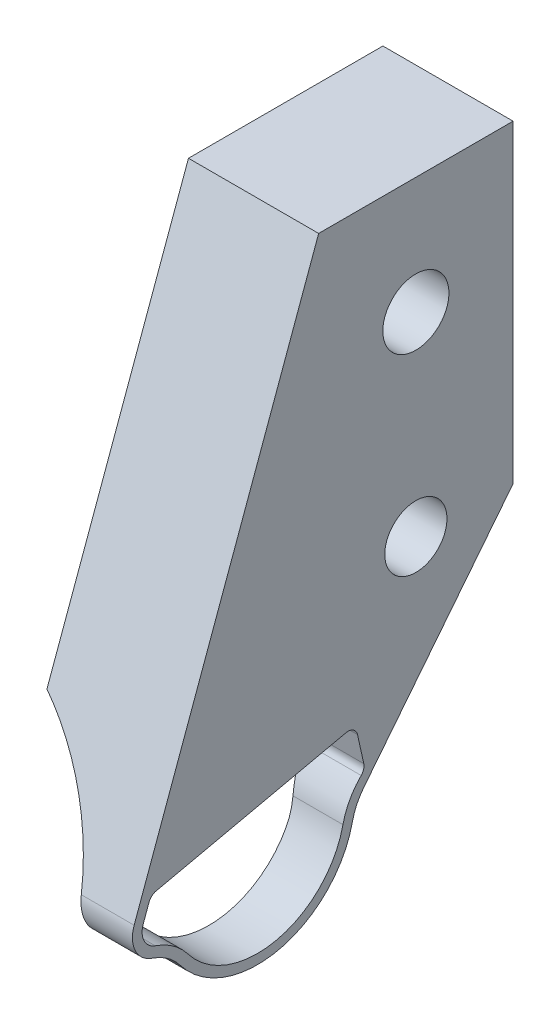
ISO-10303-21;
HEADER;
FILE_DESCRIPTION(('STEP AP214'),'2;1');
FILE_NAME('part.step','',(''),(''),'','','');
FILE_SCHEMA(('AUTOMOTIVE_DESIGN { 1 0 10303 214 1 1 1 1 }'));
ENDSEC;
DATA;
#1=APPLICATION_CONTEXT('core data for automotive mechanical design processes');
#2=APPLICATION_PROTOCOL_DEFINITION('international standard','automotive_design',2000,#1);
#3=PRODUCT_CONTEXT('',#1,'mechanical');
#4=PRODUCT('Part','Part','',(#3));
#5=PRODUCT_RELATED_PRODUCT_CATEGORY('part','',(#4));
#6=PRODUCT_DEFINITION_FORMATION('','',#4);
#7=PRODUCT_DEFINITION_CONTEXT('part definition',#1,'design');
#8=PRODUCT_DEFINITION('design','',#6,#7);
#9=PRODUCT_DEFINITION_SHAPE('','',#8);
#10=(LENGTH_UNIT() NAMED_UNIT(*) SI_UNIT(.MILLI.,.METRE.));
#11=(NAMED_UNIT(*) PLANE_ANGLE_UNIT() SI_UNIT($,.RADIAN.));
#12=(NAMED_UNIT(*) SI_UNIT($,.STERADIAN.) SOLID_ANGLE_UNIT());
#13=UNCERTAINTY_MEASURE_WITH_UNIT(LENGTH_MEASURE(1.E-05),#10,'distance_accuracy_value','');
#14=(GEOMETRIC_REPRESENTATION_CONTEXT(3) GLOBAL_UNCERTAINTY_ASSIGNED_CONTEXT((#13)) GLOBAL_UNIT_ASSIGNED_CONTEXT((#10,
#11,#12)) REPRESENTATION_CONTEXT('',''));
#15=CARTESIAN_POINT('',(0.,0.,0.));
#16=DIRECTION('',(0.,0.,1.));
#17=DIRECTION('',(1.,0.,0.));
#18=AXIS2_PLACEMENT_3D('',#15,#16,#17);
#19=CARTESIAN_POINT('',(10.4806228885964,56.7479660865774,0.));
#20=DIRECTION('',(-1.,0.,0.));
#21=DIRECTION('',(0.,0.,-1.));
#22=AXIS2_PLACEMENT_3D('',#19,#20,#21);
#23=CYLINDRICAL_SURFACE('',#22,1.7);
#24=CARTESIAN_POINT('',(-20.145,56.7479660865774,0.));
#25=DIRECTION('',(-1.,0.,0.));
#26=DIRECTION('',(0.,0.,1.));
#27=AXIS2_PLACEMENT_3D('',#24,#25,#26);
#28=CIRCLE('',#27,1.7);
#29=CARTESIAN_POINT('',(-20.145,56.7479660865774,1.7));
#30=VERTEX_POINT('',#29);
#31=EDGE_CURVE('E249',#30,#30,#28,.F.);
#32=ORIENTED_EDGE('',*,*,#31,.F.);
#33=EDGE_LOOP('',(#32));
#34=FACE_BOUND('',#33,.T.);
#35=CARTESIAN_POINT('',(-13.45,56.7479660865774,0.));
#36=DIRECTION('',(-1.,0.,0.));
#37=DIRECTION('',(0.,0.,1.));
#38=AXIS2_PLACEMENT_3D('',#35,#36,#37);
#39=CIRCLE('',#38,1.7);
#40=CARTESIAN_POINT('',(-13.45,56.7479660865774,1.7));
#41=VERTEX_POINT('',#40);
#42=EDGE_CURVE('E472',#41,#41,#39,.T.);
#43=ORIENTED_EDGE('',*,*,#42,.F.);
#44=EDGE_LOOP('',(#43));
#45=FACE_BOUND('',#44,.T.);
#46=ADVANCED_FACE('F41',(#34,#45),#23,.F.);
#47=CARTESIAN_POINT('',(10.4806228885964,15.5435493709328,19.6130723748181));
#48=DIRECTION('',(0.,-0.621108997236021,-0.78372419482396));
#49=DIRECTION('',(0.,-0.78372419482396,0.621108997236021));
#50=AXIS2_PLACEMENT_3D('',#47,#48,#49);
#51=PLANE('',#50);
#52=DIRECTION('',(0.,0.78372419482396,-0.621108997236021));
#53=VECTOR('',#52,1.);
#54=CARTESIAN_POINT('',(-20.145,15.5435493709328,19.6130723748181));
#55=LINE('',#54,#53);
#56=CARTESIAN_POINT('',(-20.145,42.7479660865774,-1.94669073858206));
#57=VERTEX_POINT('',#56);
#58=CARTESIAN_POINT('',(-20.145,46.6006752778822,-4.99999999999999));
#59=VERTEX_POINT('',#58);
#60=EDGE_CURVE('E246',#57,#59,#55,.T.);
#61=ORIENTED_EDGE('',*,*,#60,.T.);
#62=DIRECTION('',(-1.,0.,0.));
#63=VECTOR('',#62,1.);
#64=CARTESIAN_POINT('',(10.4806228885964,46.6006752778822,-5.));
#65=LINE('',#64,#63);
#66=CARTESIAN_POINT('',(-13.45,46.6006752778822,-4.99999999999999));
#67=VERTEX_POINT('',#66);
#68=EDGE_CURVE('E255',#67,#59,#65,.T.);
#69=ORIENTED_EDGE('',*,*,#68,.F.);
#70=DIRECTION('',(0.,-0.78372419482396,0.621108997236021));
#71=VECTOR('',#70,1.);
#72=CARTESIAN_POINT('',(-13.45,15.5435493709328,19.6130723748181));
#73=LINE('',#72,#71);
#74=CARTESIAN_POINT('',(-13.45,36.9081913573618,2.6813871619121));
#75=VERTEX_POINT('',#74);
#76=EDGE_CURVE('E467',#67,#75,#73,.T.);
#77=ORIENTED_EDGE('',*,*,#76,.T.);
#78=DIRECTION('',(-1.,0.,0.));
#79=VECTOR('',#78,1.);
#80=CARTESIAN_POINT('',(23.2149341165803,36.9081913573618,2.68138716191209));
#81=LINE('',#80,#79);
#82=CARTESIAN_POINT('',(-16.218762442943,36.9081913573618,2.6813871619121));
#83=VERTEX_POINT('',#82);
#84=EDGE_CURVE('E226',#75,#83,#81,.T.);
#85=ORIENTED_EDGE('',*,*,#84,.T.);
#86=CARTESIAN_POINT('',(-25.95,34.6053636156226,4.50640039861617));
#87=DIRECTION('',(0.,0.621108997236021,0.78372419482396));
#88=DIRECTION('',(0.,0.78372419482396,-0.621108997236021));
#89=AXIS2_PLACEMENT_3D('',#86,#87,#88);
#90=ELLIPSE('',#89,12.7595907668082,10.);
#91=EDGE_CURVE('E268',#57,#83,#90,.F.);
#92=ORIENTED_EDGE('',*,*,#91,.F.);
#93=EDGE_LOOP('',(#61,#69,#77,#85,#92));
#94=FACE_BOUND('',#93,.T.);
#95=ADVANCED_FACE('F495',(#94),#51,.T.);
#96=CARTESIAN_POINT('',(10.4806228885964,0.,-4.99999999999999));
#97=DIRECTION('',(0.,0.,1.));
#98=DIRECTION('',(-1.,0.,0.));
#99=AXIS2_PLACEMENT_3D('',#96,#97,#98);
#100=PLANE('',#99);
#101=ORIENTED_EDGE('',*,*,#68,.T.);
#102=DIRECTION('',(0.,-1.,0.));
#103=VECTOR('',#102,1.);
#104=CARTESIAN_POINT('',(-20.145,0.,-4.99999999999999));
#105=LINE('',#104,#103);
#106=CARTESIAN_POINT('',(-20.145,62.7479660865774,-4.99999999999999));
#107=VERTEX_POINT('',#106);
#108=EDGE_CURVE('E244',#107,#59,#105,.T.);
#109=ORIENTED_EDGE('',*,*,#108,.F.);
#110=DIRECTION('',(-1.,0.,0.));
#111=VECTOR('',#110,1.);
#112=CARTESIAN_POINT('',(10.4806228885964,62.7479660865774,-5.));
#113=LINE('',#112,#111);
#114=CARTESIAN_POINT('',(-13.45,62.7479660865774,-4.99999999999999));
#115=VERTEX_POINT('',#114);
#116=EDGE_CURVE('E258',#115,#107,#113,.T.);
#117=ORIENTED_EDGE('',*,*,#116,.F.);
#118=DIRECTION('',(0.,1.,0.));
#119=VECTOR('',#118,1.);
#120=CARTESIAN_POINT('',(-13.45,0.,-4.99999999999999));
#121=LINE('',#120,#119);
#122=EDGE_CURVE('E464',#67,#115,#121,.T.);
#123=ORIENTED_EDGE('',*,*,#122,.F.);
#124=EDGE_LOOP('',(#101,#109,#117,#123));
#125=FACE_BOUND('',#124,.T.);
#126=ADVANCED_FACE('F501',(#125),#100,.F.);
#127=CARTESIAN_POINT('',(10.4806228885964,62.7479660865774,0.));
#128=DIRECTION('',(0.,-1.,0.));
#129=DIRECTION('',(1.,0.,0.));
#130=AXIS2_PLACEMENT_3D('',#127,#128,#129);
#131=PLANE('',#130);
#132=ORIENTED_EDGE('',*,*,#116,.T.);
#133=DIRECTION('',(0.,0.,-1.));
#134=VECTOR('',#133,1.);
#135=CARTESIAN_POINT('',(-20.145,62.7479660865774,0.));
#136=LINE('',#135,#134);
#137=CARTESIAN_POINT('',(-20.145,62.7479660865774,5.));
#138=VERTEX_POINT('',#137);
#139=EDGE_CURVE('E242',#138,#107,#136,.T.);
#140=ORIENTED_EDGE('',*,*,#139,.F.);
#141=DIRECTION('',(-1.,0.,0.));
#142=VECTOR('',#141,1.);
#143=CARTESIAN_POINT('',(10.4806228885964,62.7479660865774,5.));
#144=LINE('',#143,#142);
#145=CARTESIAN_POINT('',(-13.45,62.7479660865774,5.));
#146=VERTEX_POINT('',#145);
#147=EDGE_CURVE('E261',#146,#138,#144,.T.);
#148=ORIENTED_EDGE('',*,*,#147,.F.);
#149=DIRECTION('',(0.,0.,1.));
#150=VECTOR('',#149,1.);
#151=CARTESIAN_POINT('',(-13.45,62.7479660865774,0.));
#152=LINE('',#151,#150);
#153=EDGE_CURVE('E461',#115,#146,#152,.T.);
#154=ORIENTED_EDGE('',*,*,#153,.F.);
#155=EDGE_LOOP('',(#132,#140,#148,#154));
#156=FACE_BOUND('',#155,.T.);
#157=ADVANCED_FACE('F511',(#156),#131,.F.);
#158=CARTESIAN_POINT('',(10.4806228885964,8.94708669868443,24.5819186745387));
#159=DIRECTION('',(0.,-0.342020143325663,-0.939692620785911));
#160=DIRECTION('',(0.,-0.939692620785911,0.342020143325663));
#161=AXIS2_PLACEMENT_3D('',#158,#159,#160);
#162=PLANE('',#161);
#163=ORIENTED_EDGE('',*,*,#147,.T.);
#164=DIRECTION('',(0.,0.93969262078591,-0.342020143325663));
#165=VECTOR('',#164,1.);
#166=CARTESIAN_POINT('',(-20.145,8.94708669868443,24.5819186745387));
#167=LINE('',#166,#165);
#168=CARTESIAN_POINT('',(-20.145,42.7479660865774,12.2794046853239));
#169=VERTEX_POINT('',#168);
#170=EDGE_CURVE('E240',#169,#138,#167,.T.);
#171=ORIENTED_EDGE('',*,*,#170,.F.);
#172=CARTESIAN_POINT('',(-25.95,34.6053636156226,15.2430696142139));
#173=DIRECTION('',(0.,0.342020143325663,0.939692620785911));
#174=DIRECTION('',(0.,0.93969262078591,-0.342020143325663));
#175=AXIS2_PLACEMENT_3D('',#172,#173,#174);
#176=ELLIPSE('',#175,10.6417777247591,10.);
#177=CARTESIAN_POINT('',(-16.1675328753228,36.6798122061183,14.4880320747579));
#178=VERTEX_POINT('',#177);
#179=EDGE_CURVE('E11',#178,#169,#176,.T.);
#180=ORIENTED_EDGE('',*,*,#179,.F.);
#181=DIRECTION('',(-1.,0.,0.));
#182=VECTOR('',#181,1.);
#183=CARTESIAN_POINT('',(23.2149341165803,36.6798122061183,14.4880320747579));
#184=LINE('',#183,#182);
#185=CARTESIAN_POINT('',(-13.45,36.6798122061183,14.4880320747579));
#186=VERTEX_POINT('',#185);
#187=EDGE_CURVE('E229',#186,#178,#184,.T.);
#188=ORIENTED_EDGE('',*,*,#187,.F.);
#189=DIRECTION('',(0.,-0.939692620785911,0.342020143325663));
#190=VECTOR('',#189,1.);
#191=CARTESIAN_POINT('',(-13.45,8.94708669868443,24.5819186745387));
#192=LINE('',#191,#190);
#193=EDGE_CURVE('E458',#146,#186,#192,.T.);
#194=ORIENTED_EDGE('',*,*,#193,.F.);
#195=EDGE_LOOP('',(#163,#171,#180,#188,#194));
#196=FACE_BOUND('',#195,.T.);
#197=ADVANCED_FACE('F514',(#196),#162,.F.);
#198=CARTESIAN_POINT('',(-20.145,0.,0.));
#199=DIRECTION('',(1.,0.,0.));
#200=DIRECTION('',(0.,0.,1.));
#201=AXIS2_PLACEMENT_3D('',#198,#199,#200);
#202=PLANE('',#201);
#203=DIRECTION('',(0.,0.,-1.));
#204=VECTOR('',#203,1.);
#205=CARTESIAN_POINT('',(-20.145,42.7479660865774,0.));
#206=LINE('',#205,#204);
#207=EDGE_CURVE('E236',#169,#57,#206,.T.);
#208=ORIENTED_EDGE('',*,*,#207,.F.);
#209=ORIENTED_EDGE('',*,*,#170,.T.);
#210=ORIENTED_EDGE('',*,*,#139,.T.);
#211=ORIENTED_EDGE('',*,*,#108,.T.);
#212=ORIENTED_EDGE('',*,*,#60,.F.);
#213=EDGE_LOOP('',(#208,#209,#210,#211,#212));
#214=FACE_BOUND('',#213,.T.);
#215=ORIENTED_EDGE('',*,*,#31,.T.);
#216=EDGE_LOOP('',(#215));
#217=FACE_BOUND('',#216,.T.);
#218=CARTESIAN_POINT('',(-20.145,46.7479660865774,0.));
#219=DIRECTION('',(-1.,0.,0.));
#220=DIRECTION('',(0.,0.,1.));
#221=AXIS2_PLACEMENT_3D('',#218,#219,#220);
#222=CIRCLE('',#221,1.59999999999999);
#223=CARTESIAN_POINT('',(-20.145,46.7479660865774,1.6));
#224=VERTEX_POINT('',#223);
#225=EDGE_CURVE('E252',#224,#224,#222,.T.);
#226=ORIENTED_EDGE('',*,*,#225,.F.);
#227=EDGE_LOOP('',(#226));
#228=FACE_BOUND('',#227,.T.);
#229=ADVANCED_FACE('F517',(#214,#217,#228),#202,.F.);
#230=CARTESIAN_POINT('',(10.4806228885964,46.7479660865774,0.));
#231=DIRECTION('',(-1.,0.,0.));
#232=DIRECTION('',(0.,0.,-1.));
#233=AXIS2_PLACEMENT_3D('',#230,#231,#232);
#234=CYLINDRICAL_SURFACE('',#233,1.59999999999999);
#235=ORIENTED_EDGE('',*,*,#225,.T.);
#236=EDGE_LOOP('',(#235));
#237=FACE_BOUND('',#236,.T.);
#238=CARTESIAN_POINT('',(-13.45,46.7479660865774,0.));
#239=DIRECTION('',(-1.,0.,0.));
#240=DIRECTION('',(0.,0.,1.));
#241=AXIS2_PLACEMENT_3D('',#238,#239,#240);
#242=CIRCLE('',#241,1.59999999999999);
#243=CARTESIAN_POINT('',(-13.45,46.7479660865774,1.6));
#244=VERTEX_POINT('',#243);
#245=EDGE_CURVE('E203',#244,#244,#242,.T.);
#246=ORIENTED_EDGE('',*,*,#245,.F.);
#247=EDGE_LOOP('',(#246));
#248=FACE_BOUND('',#247,.T.);
#249=ADVANCED_FACE('F292',(#237,#248),#234,.F.);
#250=CARTESIAN_POINT('',(23.2149341165803,35.0448643656538,0.330214577440214));
#251=DIRECTION('',(-1.,0.,0.));
#252=DIRECTION('',(0.,0.,-1.));
#253=AXIS2_PLACEMENT_3D('',#250,#251,#252);
#254=CYLINDRICAL_SURFACE('',#253,3.);
#255=DIRECTION('',(-1.,0.,0.));
#256=VECTOR('',#255,1.);
#257=CARTESIAN_POINT('',(23.2149341165803,35.6835275110001,3.26144459004179));
#258=LINE('',#257,#256);
#259=CARTESIAN_POINT('',(-13.45,35.6835275110001,3.2614445900418));
#260=VERTEX_POINT('',#259);
#261=CARTESIAN_POINT('',(-16.0082917657626,35.6835275110001,3.2614445900418));
#262=VERTEX_POINT('',#261);
#263=EDGE_CURVE('E223',#260,#262,#258,.T.);
#264=ORIENTED_EDGE('',*,*,#263,.T.);
#265=CARTESIAN_POINT('',(-16.218762442943,36.9081913573618,2.68138716191209));
#266=CARTESIAN_POINT('',(-16.2031119911732,36.8420785486139,2.73379025762021));
#267=CARTESIAN_POINT('',(-16.1876509206205,36.7737158458215,2.78342011184647));
#268=CARTESIAN_POINT('',(-16.1574372357355,36.6328930276627,2.87683965137037));
#269=CARTESIAN_POINT('',(-16.1426851155635,36.5604301287947,2.92062529980248));
#270=CARTESIAN_POINT('',(-16.1145125601555,36.4133169873703,3.00121435499207));
#271=CARTESIAN_POINT('',(-16.1010721010692,36.3387347674945,3.03813494453304));
#272=CARTESIAN_POINT('',(-16.0755080420653,36.186612978632,3.10570191181529));
#273=CARTESIAN_POINT('',(-16.0633835951442,36.1090753557327,3.13635233649673));
#274=CARTESIAN_POINT('',(-16.0439162058909,35.9738508455854,3.18338079291822));
#275=CARTESIAN_POINT('',(-16.0361918214002,35.9167640600316,3.20134213050387));
#276=CARTESIAN_POINT('',(-16.0215756819415,35.8011149118365,3.23395732595414));
#277=CARTESIAN_POINT('',(-16.0146900732958,35.742545061221,3.24858738057316));
#278=CARTESIAN_POINT('',(-16.0082917657626,35.6835275110001,3.26144459004185));
#279=B_SPLINE_CURVE_WITH_KNOTS('',3,(#265,#266,#267,#268,#269,#270,#271,#272,#273,#274,#275,
#276,#277,#278),.UNSPECIFIED.,.F.,.F.,(4,2,2,2,2,2,4),(0.,0.257340284217624,0.514857415468429,
0.76746588898362,1.01991080389975,1.2008304064854,1.38300479014081),.UNSPECIFIED.);
#280=EDGE_CURVE('E271',#83,#262,#279,.T.);
#281=ORIENTED_EDGE('',*,*,#280,.F.);
#282=ORIENTED_EDGE('',*,*,#84,.F.);
#283=CARTESIAN_POINT('',(-13.45,35.0448643656538,0.330214577440219));
#284=DIRECTION('',(-1.,0.,0.));
#285=DIRECTION('',(0.,0.,1.));
#286=AXIS2_PLACEMENT_3D('',#283,#284,#285);
#287=CIRCLE('',#286,3.);
#288=EDGE_CURVE('E470',#260,#75,#287,.T.);
#289=ORIENTED_EDGE('',*,*,#288,.F.);
#290=EDGE_LOOP('',(#264,#281,#282,#289));
#291=FACE_BOUND('',#290,.T.);
#292=ADVANCED_FACE('F286',(#291),#254,.F.);
#293=CARTESIAN_POINT('',(23.2149341165803,36.1667819911298,13.0784931435791));
#294=DIRECTION('',(-1.,0.,0.));
#295=DIRECTION('',(0.,0.,-1.));
#296=AXIS2_PLACEMENT_3D('',#293,#294,#295);
#297=CYLINDRICAL_SURFACE('',#296,1.5);
#298=CARTESIAN_POINT('',(-13.45,36.1667819911298,13.0784931435791));
#299=DIRECTION('',(-1.,0.,0.));
#300=DIRECTION('',(0.,0.,1.));
#301=AXIS2_PLACEMENT_3D('',#298,#299,#300);
#302=CIRCLE('',#301,1.5);
#303=CARTESIAN_POINT('',(-13.45,34.7448507210714,13.556103301794));
#304=VERTEX_POINT('',#303);
#305=EDGE_CURVE('E456',#304,#186,#302,.T.);
#306=ORIENTED_EDGE('',*,*,#305,.T.);
#307=ORIENTED_EDGE('',*,*,#187,.T.);
#308=CARTESIAN_POINT('',(-15.9509728799541,34.7448507210714,13.556103301794));
#309=CARTESIAN_POINT('',(-15.9511611201098,34.7582575404278,13.5960169486821));
#310=CARTESIAN_POINT('',(-15.951397209145,34.7733390237569,13.6353467117156));
#311=CARTESIAN_POINT('',(-15.9520138071208,34.8067511977555,13.7125981174369));
#312=CARTESIAN_POINT('',(-15.9523943111477,34.8250817778653,13.7505198079852));
#313=CARTESIAN_POINT('',(-15.9538240979371,34.8847381359718,13.8617037209504));
#314=CARTESIAN_POINT('',(-15.9551619317631,34.9307698306167,13.9325073363417));
#315=CARTESIAN_POINT('',(-15.9590587021174,35.0340284310216,14.0653887732117));
#316=CARTESIAN_POINT('',(-15.9616183417922,35.0912617720998,14.1274615434436));
#317=CARTESIAN_POINT('',(-15.9684230385377,35.215254094426,14.2411024473258));
#318=CARTESIAN_POINT('',(-15.9726676969909,35.2820108203781,14.2926730610624));
#319=CARTESIAN_POINT('',(-15.9832240931038,35.4228876849543,14.383727605055));
#320=CARTESIAN_POINT('',(-15.989529833075,35.4969860288151,14.4232459695963));
#321=CARTESIAN_POINT('',(-16.0044703700032,35.6505354826737,14.4893352183812));
#322=CARTESIAN_POINT('',(-16.0131053396198,35.7299869891596,14.5159051423812));
#323=CARTESIAN_POINT('',(-16.0327668085834,35.8918825536113,14.5554405982331));
#324=CARTESIAN_POINT('',(-16.0437925288181,35.9743256293955,14.5684105541077));
#325=CARTESIAN_POINT('',(-16.0680871574535,36.1398985366373,14.5805466630833));
#326=CARTESIAN_POINT('',(-16.0813559134736,36.2230283210786,14.5797137535083));
#327=CARTESIAN_POINT('',(-16.1066107582631,36.3694267785127,14.5661364499318));
#328=CARTESIAN_POINT('',(-16.1182316048985,36.4330222113839,14.5560669214766));
#329=CARTESIAN_POINT('',(-16.1423150831483,36.5581644441492,14.5279541111028));
#330=CARTESIAN_POINT('',(-16.1547765006713,36.6197140148813,14.5099221294437));
#331=CARTESIAN_POINT('',(-16.1675328753228,36.6798122061183,14.4880320747579));
#332=B_SPLINE_CURVE_WITH_KNOTS('',3,(#308,#309,#310,#311,#312,#313,#314,#315,#316,#317,#318,
#319,#320,#321,#322,#323,#324,#325,#326,#327,#328,#329,#330,#331),.UNSPECIFIED.,.F.,.F.,(4,2,2,
2,2,2,2,2,2,2,2,4),(0.,0.126239367634021,0.252474440439615,0.504561541556302,0.756793893459327,
1.00896661139762,1.26041195142526,1.51187593555478,1.76325809391521,2.01462318150252,
2.21040081664307,2.40590149403265),.UNSPECIFIED.);
#333=CARTESIAN_POINT('',(-15.9509728799541,34.7448507210714,13.556103301794));
#334=VERTEX_POINT('',#333);
#335=EDGE_CURVE('E50',#334,#178,#332,.T.);
#336=ORIENTED_EDGE('',*,*,#335,.F.);
#337=DIRECTION('',(-1.,0.,0.));
#338=VECTOR('',#337,1.);
#339=CARTESIAN_POINT('',(23.2149341165803,34.7448507210714,13.556103301794));
#340=LINE('',#339,#338);
#341=EDGE_CURVE('E231',#304,#334,#340,.T.);
#342=ORIENTED_EDGE('',*,*,#341,.F.);
#343=EDGE_LOOP('',(#306,#307,#336,#342));
#344=FACE_BOUND('',#343,.T.);
#345=ADVANCED_FACE('F291',(#344),#297,.T.);
#346=CARTESIAN_POINT('',(23.2149341165803,31.9009881809546,14.5113236182238));
#347=DIRECTION('',(-1.,0.,0.));
#348=DIRECTION('',(0.,0.,-1.));
#349=AXIS2_PLACEMENT_3D('',#346,#347,#348);
#350=CYLINDRICAL_SURFACE('',#349,3.);
#351=ORIENTED_EDGE('',*,*,#341,.T.);
#352=CARTESIAN_POINT('',(-15.95,34.6053636156226,13.2127268723614));
#353=CARTESIAN_POINT('',(-15.9500256136083,34.6321501026627,13.2685191916852));
#354=CARTESIAN_POINT('',(-15.9501194937417,34.6571672716219,13.3250300537554));
#355=CARTESIAN_POINT('',(-15.9504437870593,34.7036629734489,13.4394888635619));
#356=CARTESIAN_POINT('',(-15.9506742002439,34.725141506306,13.4974368113026));
#357=CARTESIAN_POINT('',(-15.9509728799541,34.7448507210714,13.556103301794));
#358=B_SPLINE_CURVE_WITH_KNOTS('',3,(#352,#353,#354,#355,#356,#357),.UNSPECIFIED.,.F.,.F.,(4,2,
4),(0.,0.185402550665165,0.370805101892429),.UNSPECIFIED.);
#359=CARTESIAN_POINT('',(-15.95,34.6053636156226,13.2127268723614));
#360=VERTEX_POINT('',#359);
#361=EDGE_CURVE('E60',#360,#334,#358,.T.);
#362=ORIENTED_EDGE('',*,*,#361,.F.);
#363=CARTESIAN_POINT('',(-15.95,31.9009881809546,14.5113236182238));
#364=DIRECTION('',(-1.,0.,0.));
#365=DIRECTION('',(0.,0.,1.));
#366=AXIS2_PLACEMENT_3D('',#363,#364,#365);
#367=CIRCLE('',#366,3.);
#368=CARTESIAN_POINT('',(-15.95,33.7186048955631,12.1246377405315));
#369=VERTEX_POINT('',#368);
#370=EDGE_CURVE('E219',#360,#369,#367,.T.);
#371=ORIENTED_EDGE('',*,*,#370,.T.);
#372=DIRECTION('',(-1.,0.,0.));
#373=VECTOR('',#372,1.);
#374=CARTESIAN_POINT('',(23.2149341165803,33.7186048955631,12.1246377405315));
#375=LINE('',#374,#373);
#376=CARTESIAN_POINT('',(-13.45,33.7186048955631,12.1246377405315));
#377=VERTEX_POINT('',#376);
#378=EDGE_CURVE('E233',#377,#369,#375,.T.);
#379=ORIENTED_EDGE('',*,*,#378,.F.);
#380=CARTESIAN_POINT('',(-13.45,31.9009881809546,14.5113236182238));
#381=DIRECTION('',(-1.,0.,0.));
#382=DIRECTION('',(0.,0.,1.));
#383=AXIS2_PLACEMENT_3D('',#380,#381,#382);
#384=CIRCLE('',#383,3.);
#385=EDGE_CURVE('E453',#304,#377,#384,.T.);
#386=ORIENTED_EDGE('',*,*,#385,.F.);
#387=EDGE_LOOP('',(#351,#362,#371,#379,#386));
#388=FACE_BOUND('',#387,.T.);
#389=ADVANCED_FACE('F299',(#388),#350,.F.);
#390=CARTESIAN_POINT('',(23.2149341165803,36.7479660865774,8.14682794437777));
#391=DIRECTION('',(-1.,0.,0.));
#392=DIRECTION('',(0.,0.,-1.));
#393=AXIS2_PLACEMENT_3D('',#390,#391,#392);
#394=CYLINDRICAL_SURFACE('',#393,5.);
#395=CARTESIAN_POINT('',(-13.45,36.7479660865774,8.14682794437778));
#396=DIRECTION('',(-1.,0.,0.));
#397=DIRECTION('',(0.,0.,1.));
#398=AXIS2_PLACEMENT_3D('',#395,#396,#397);
#399=CIRCLE('',#398,5.);
#400=EDGE_CURVE('E451',#260,#377,#399,.T.);
#401=ORIENTED_EDGE('',*,*,#400,.T.);
#402=ORIENTED_EDGE('',*,*,#378,.T.);
#403=CARTESIAN_POINT('',(-15.95,36.7479660865774,8.14682794437778));
#404=DIRECTION('',(-1.,0.,0.));
#405=DIRECTION('',(0.,0.,1.));
#406=AXIS2_PLACEMENT_3D('',#403,#404,#405);
#407=CIRCLE('',#406,5.);
#408=CARTESIAN_POINT('',(-15.95,34.6053636156226,3.62916763715478));
#409=VERTEX_POINT('',#408);
#410=EDGE_CURVE('E217',#409,#369,#407,.T.);
#411=ORIENTED_EDGE('',*,*,#410,.F.);
#412=CARTESIAN_POINT('',(-16.0082917657626,35.6835275110001,3.2614445900418));
#413=CARTESIAN_POINT('',(-15.9982235133905,35.5907413538277,3.28165484114388));
#414=CARTESIAN_POINT('',(-15.9895284768808,35.4983934612272,3.30455079365494));
#415=CARTESIAN_POINT('',(-15.9748140726766,35.3153192273774,3.35553364426875));
#416=CARTESIAN_POINT('',(-15.9687843100843,35.2245879349925,3.3835997598736));
#417=CARTESIAN_POINT('',(-15.9592521174647,35.0447568195509,3.44490247825155));
#418=CARTESIAN_POINT('',(-15.9557496540813,34.9556569749768,3.47813901277653));
#419=CARTESIAN_POINT('',(-15.9511165422667,34.7790941225902,3.54979957166166));
#420=CARTESIAN_POINT('',(-15.9499953194228,34.6916389726786,3.58824357269477));
#421=CARTESIAN_POINT('',(-15.95,34.6053636156226,3.62916763715478));
#422=B_SPLINE_CURVE_WITH_KNOTS('',3,(#412,#413,#414,#415,#416,#417,#418,#419,#420,#421),
.UNSPECIFIED.,.F.,.F.,(4,2,2,2,4),(0.,0.286430441654338,0.571733694147017,0.857033181033154,
1.14345987091277),.UNSPECIFIED.);
#423=EDGE_CURVE('E279',#262,#409,#422,.T.);
#424=ORIENTED_EDGE('',*,*,#423,.F.);
#425=ORIENTED_EDGE('',*,*,#263,.F.);
#426=EDGE_LOOP('',(#401,#402,#411,#424,#425));
#427=FACE_BOUND('',#426,.T.);
#428=ADVANCED_FACE('F412',(#427),#394,.T.);
#429=CARTESIAN_POINT('',(23.2149341165803,37.8650202363476,3.16688883878769));
#430=DIRECTION('',(-1.,0.,0.));
#431=DIRECTION('',(0.,0.,-1.));
#432=AXIS2_PLACEMENT_3D('',#429,#430,#431);
#433=CYLINDRICAL_SURFACE('',#432,0.499999999999999);
#434=DIRECTION('',(-1.,0.,0.));
#435=VECTOR('',#434,1.);
#436=CARTESIAN_POINT('',(23.2149341165803,37.9732400433166,2.67874083522772));
#437=LINE('',#436,#435);
#438=CARTESIAN_POINT('',(-13.45,37.9732400433166,2.67874083522772));
#439=VERTEX_POINT('',#438);
#440=CARTESIAN_POINT('',(-16.5341936952918,37.9732400433166,2.67874083522772));
#441=VERTEX_POINT('',#440);
#442=EDGE_CURVE('E200',#439,#441,#437,.T.);
#443=ORIENTED_EDGE('',*,*,#442,.T.);
#444=CARTESIAN_POINT('',(-16.3818991608927,37.5125007525109,2.81230455611926));
#445=CARTESIAN_POINT('',(-16.3881447743461,37.5330664879469,2.7918262014019));
#446=CARTESIAN_POINT('',(-16.3949847514548,37.5553313472582,2.77328301581002));
#447=CARTESIAN_POINT('',(-16.4096479321952,37.6024075035502,2.74045142767633));
#448=CARTESIAN_POINT('',(-16.4174678989011,37.6272103701067,2.72614951692839));
#449=CARTESIAN_POINT('',(-16.4339240964108,37.6786405744617,2.70205472776288));
#450=CARTESIAN_POINT('',(-16.4425599255748,37.7052670127792,2.6922596444841));
#451=CARTESIAN_POINT('',(-16.4604524629809,37.7596157725324,2.67731297123646));
#452=CARTESIAN_POINT('',(-16.4697096824333,37.7873389883809,2.67216525617399));
#453=CARTESIAN_POINT('',(-16.4881253527691,37.8416737808754,2.66672774018356));
#454=CARTESIAN_POINT('',(-16.4972641848201,37.8682687656963,2.66620063692089));
#455=CARTESIAN_POINT('',(-16.5156772999521,37.9211377106675,2.66934075881368));
#456=CARTESIAN_POINT('',(-16.5249514632567,37.9474119208864,2.67300447364565));
#457=CARTESIAN_POINT('',(-16.5341936952918,37.9732400433166,2.67874083522772));
#458=B_SPLINE_CURVE_WITH_KNOTS('',3,(#444,#445,#446,#447,#448,#449,#450,#451,#452,#453,#454,
#455,#456,#457),.UNSPECIFIED.,.F.,.F.,(4,2,2,2,2,2,4),(0.,0.0889011732931152,0.17751608334903,
0.266087594390686,0.354732887017099,0.438797114590686,0.522790979606495),.UNSPECIFIED.);
#459=CARTESIAN_POINT('',(-16.3818991608927,37.5125007525109,2.81230455611926));
#460=VERTEX_POINT('',#459);
#461=EDGE_CURVE('E398',#460,#441,#458,.T.);
#462=ORIENTED_EDGE('',*,*,#461,.F.);
#463=DIRECTION('',(-1.,0.,0.));
#464=VECTOR('',#463,1.);
#465=CARTESIAN_POINT('',(23.2149341165803,37.5125007525109,2.81230455611925));
#466=LINE('',#465,#464);
#467=CARTESIAN_POINT('',(-13.45,37.5125007525109,2.81230455611926));
#468=VERTEX_POINT('',#467);
#469=EDGE_CURVE('E202',#468,#460,#466,.T.);
#470=ORIENTED_EDGE('',*,*,#469,.F.);
#471=CARTESIAN_POINT('',(-13.45,37.8650202363476,3.16688883878769));
#472=DIRECTION('',(-1.,0.,0.));
#473=DIRECTION('',(0.,0.,1.));
#474=AXIS2_PLACEMENT_3D('',#471,#472,#473);
#475=CIRCLE('',#474,0.499999999999999);
#476=EDGE_CURVE('E187',#439,#468,#475,.T.);
#477=ORIENTED_EDGE('',*,*,#476,.F.);
#478=EDGE_LOOP('',(#443,#462,#470,#477));
#479=FACE_BOUND('',#478,.T.);
#480=ADVANCED_FACE('F198',(#479),#433,.F.);
#481=CARTESIAN_POINT('',(23.2149341165803,1.21285604880447,-5.4708400930604));
#482=DIRECTION('',(0.,-0.216439613938098,0.976296007119934));
#483=DIRECTION('',(0.,0.976296007119934,0.216439613938098));
#484=AXIS2_PLACEMENT_3D('',#481,#482,#483);
#485=PLANE('',#484);
#486=DIRECTION('',(-1.,0.,0.));
#487=VECTOR('',#486,1.);
#488=CARTESIAN_POINT('',(23.2149341165803,39.4252661460618,3.00064727222454));
#489=LINE('',#488,#487);
#490=CARTESIAN_POINT('',(-13.45,39.4252661460618,3.00064727222455));
#491=VERTEX_POINT('',#490);
#492=CARTESIAN_POINT('',(-17.1882342192304,39.4252661460618,3.00064727222455));
#493=VERTEX_POINT('',#492);
#494=EDGE_CURVE('E209',#491,#493,#489,.T.);
#495=ORIENTED_EDGE('',*,*,#494,.T.);
#496=CARTESIAN_POINT('',(-25.95,34.6053636156226,1.932100606767));
#497=DIRECTION('',(0.,0.216439613938098,-0.976296007119934));
#498=DIRECTION('',(0.,-0.976296007119934,-0.216439613938098));
#499=AXIS2_PLACEMENT_3D('',#496,#497,#498);
#500=ELLIPSE('',#499,10.2427951431451,10.);
#501=EDGE_CURVE('E207',#441,#493,#500,.F.);
#502=ORIENTED_EDGE('',*,*,#501,.F.);
#503=ORIENTED_EDGE('',*,*,#442,.F.);
#504=DIRECTION('',(0.,-0.976296007119934,-0.216439613938098));
#505=VECTOR('',#504,1.);
#506=CARTESIAN_POINT('',(-13.45,1.21285604880447,-5.4708400930604));
#507=LINE('',#506,#505);
#508=EDGE_CURVE('E183',#491,#439,#507,.T.);
#509=ORIENTED_EDGE('',*,*,#508,.F.);
#510=EDGE_LOOP('',(#495,#502,#503,#509));
#511=FACE_BOUND('',#510,.T.);
#512=ADVANCED_FACE('F205',(#511),#485,.T.);
#513=CARTESIAN_POINT('',(23.2149341165803,39.3170463390927,3.48879527578451));
#514=DIRECTION('',(-1.,0.,0.));
#515=DIRECTION('',(0.,0.,-1.));
#516=AXIS2_PLACEMENT_3D('',#513,#514,#515);
#517=CYLINDRICAL_SURFACE('',#516,0.500000000000003);
#518=DIRECTION('',(-1.,0.,0.));
#519=VECTOR('',#518,1.);
#520=CARTESIAN_POINT('',(23.2149341165803,39.8051943426527,3.59701508275356));
#521=LINE('',#520,#519);
#522=CARTESIAN_POINT('',(-13.45,39.8051943426527,3.59701508275356));
#523=VERTEX_POINT('',#522);
#524=CARTESIAN_POINT('',(-17.4082343505436,39.8051943426527,3.59701508275356));
#525=VERTEX_POINT('',#524);
#526=EDGE_CURVE('E211',#523,#525,#521,.T.);
#527=ORIENTED_EDGE('',*,*,#526,.T.);
#528=CARTESIAN_POINT('',(-17.1882342192304,39.4252661460618,3.00064727222455));
#529=CARTESIAN_POINT('',(-17.2046082039624,39.4550444072664,3.00724450988577));
#530=CARTESIAN_POINT('',(-17.2209049274177,39.4842966824001,3.01659393097647));
#531=CARTESIAN_POINT('',(-17.2528977451483,39.5410954097743,3.04073318057945));
#532=CARTESIAN_POINT('',(-17.2685892689418,39.568629595124,3.05555783167353));
#533=CARTESIAN_POINT('',(-17.2987417020508,39.6210046097872,3.09054392202618));
#534=CARTESIAN_POINT('',(-17.3131990201159,39.6458376332267,3.11072027773206));
#535=CARTESIAN_POINT('',(-17.340098291569,39.6916485267979,3.156069574121));
#536=CARTESIAN_POINT('',(-17.3525464198096,39.7126382364144,3.18122665547544));
#537=CARTESIAN_POINT('',(-17.3719885356499,39.7452069369636,3.22935847511587));
#538=CARTESIAN_POINT('',(-17.3795734748808,39.7578341614048,3.25138912509747));
#539=CARTESIAN_POINT('',(-17.3927898962481,39.7797543311198,3.29760451260163));
#540=CARTESIAN_POINT('',(-17.3984221650849,39.7890486192336,3.32178837768048));
#541=CARTESIAN_POINT('',(-17.4074256504832,39.8038730384294,3.37181801337741));
#542=CARTESIAN_POINT('',(-17.4107863149098,39.809385604267,3.39767093701221));
#543=CARTESIAN_POINT('',(-17.4149722678797,39.8162482564226,3.45012714266075));
#544=CARTESIAN_POINT('',(-17.4157992261066,39.8176010839629,3.4767299188585));
#545=CARTESIAN_POINT('',(-17.4150550066378,39.81638207301,3.51905964456434));
#546=CARTESIAN_POINT('',(-17.4143146477444,39.8151699955996,3.53485708544292));
#547=CARTESIAN_POINT('',(-17.4119382052098,39.8112741299326,3.56617820686817));
#548=CARTESIAN_POINT('',(-17.4103034160879,39.8085924686129,3.58170224967037));
#549=CARTESIAN_POINT('',(-17.4082343505436,39.8051943426527,3.59701508275356));
#550=B_SPLINE_CURVE_WITH_KNOTS('',3,(#528,#529,#530,#531,#532,#533,#534,#535,#536,#537,#538,
#539,#540,#541,#542,#543,#544,#545,#546,#547,#548,#549),.UNSPECIFIED.,.F.,.F.,(4,2,2,2,2,2,2,2,
2,2,4),(0.,0.103798729996324,0.208269321126745,0.313034212990288,0.417470733645761,
0.496644947318863,0.575787225769761,0.655294657604776,0.734749683664518,0.782245087606782,
0.829671932036616),.UNSPECIFIED.);
#551=EDGE_CURVE('E392',#493,#525,#550,.T.);
#552=ORIENTED_EDGE('',*,*,#551,.F.);
#553=ORIENTED_EDGE('',*,*,#494,.F.);
#554=CARTESIAN_POINT('',(-13.45,39.3170463390927,3.48879527578451));
#555=DIRECTION('',(-1.,0.,0.));
#556=DIRECTION('',(0.,0.,1.));
#557=AXIS2_PLACEMENT_3D('',#554,#555,#556);
#558=CIRCLE('',#557,0.500000000000003);
#559=EDGE_CURVE('E190',#523,#491,#558,.T.);
#560=ORIENTED_EDGE('',*,*,#559,.F.);
#561=EDGE_LOOP('',(#527,#552,#553,#560));
#562=FACE_BOUND('',#561,.T.);
#563=ADVANCED_FACE('F390',(#562),#517,.F.);
#564=CARTESIAN_POINT('',(23.2149341165803,38.7005581008173,8.57970717225394));
#565=DIRECTION('',(0.,0.976296007119935,0.216439613938097));
#566=DIRECTION('',(0.,0.216439613938097,-0.976296007119935));
#567=AXIS2_PLACEMENT_3D('',#564,#565,#566);
#568=PLANE('',#567);
#569=DIRECTION('',(0.,-0.216439613938097,0.976296007119935));
#570=VECTOR('',#569,1.);
#571=CARTESIAN_POINT('',(-13.45,38.7005581008173,8.57970717225395));
#572=LINE('',#571,#570);
#573=CARTESIAN_POINT('',(-13.45,37.6407982032717,13.3599751539529));
#574=VERTEX_POINT('',#573);
#575=EDGE_CURVE('E395',#523,#574,#572,.T.);
#576=ORIENTED_EDGE('',*,*,#575,.T.);
#577=DIRECTION('',(-1.,0.,0.));
#578=VECTOR('',#577,1.);
#579=CARTESIAN_POINT('',(23.2149341165803,37.6407982032717,13.3599751539529));
#580=LINE('',#579,#578);
#581=CARTESIAN_POINT('',(-16.4218240536762,37.6407982032717,13.3599751539529));
#582=VERTEX_POINT('',#581);
#583=EDGE_CURVE('E385',#574,#582,#580,.T.);
#584=ORIENTED_EDGE('',*,*,#583,.T.);
#585=CARTESIAN_POINT('',(-25.95,34.6053636156226,27.0519357607724));
#586=DIRECTION('',(0.,-0.976296007119935,-0.216439613938097));
#587=DIRECTION('',(0.,0.216439613938097,-0.976296007119935));
#588=AXIS2_PLACEMENT_3D('',#585,#586,#587);
#589=ELLIPSE('',#588,46.2022631534542,10.);
#590=EDGE_CURVE('E360',#525,#582,#589,.T.);
#591=ORIENTED_EDGE('',*,*,#590,.F.);
#592=ORIENTED_EDGE('',*,*,#526,.F.);
#593=EDGE_LOOP('',(#576,#584,#591,#592));
#594=FACE_BOUND('',#593,.T.);
#595=ADVANCED_FACE('F348',(#594),#568,.F.);
#596=CARTESIAN_POINT('',(23.2149341165803,37.1526501997118,13.2517553469839));
#597=DIRECTION('',(-1.,0.,0.));
#598=DIRECTION('',(0.,0.,-1.));
#599=AXIS2_PLACEMENT_3D('',#596,#597,#598);
#600=CYLINDRICAL_SURFACE('',#599,0.500000000000003);
#601=DIRECTION('',(-1.,0.,0.));
#602=VECTOR('',#601,1.);
#603=CARTESIAN_POINT('',(23.2149341165803,37.3236602713746,13.7216016573768));
#604=LINE('',#603,#602);
#605=CARTESIAN_POINT('',(-13.45,37.3236602713746,13.7216016573768));
#606=VERTEX_POINT('',#605);
#607=CARTESIAN_POINT('',(-16.3265461869801,37.3236602713746,13.7216016573768));
#608=VERTEX_POINT('',#607);
#609=EDGE_CURVE('E379',#606,#608,#604,.T.);
#610=ORIENTED_EDGE('',*,*,#609,.T.);
#611=CARTESIAN_POINT('',(-16.4218240536762,37.6407982032717,13.3599751539529));
#612=CARTESIAN_POINT('',(-16.4199184123267,37.6348093549067,13.3871065838312));
#613=CARTESIAN_POINT('',(-16.4172841061554,37.6265281456412,13.4136525164757));
#614=CARTESIAN_POINT('',(-16.4107457855924,37.6058231280776,13.4647938269734));
#615=CARTESIAN_POINT('',(-16.4068466373182,37.5934151916283,13.4893962379328));
#616=CARTESIAN_POINT('',(-16.39795029449,37.5648510085498,13.5360812573422));
#617=CARTESIAN_POINT('',(-16.3929533983887,37.5486957806573,13.5581645482093));
#618=CARTESIAN_POINT('',(-16.3820705731595,37.5131246776247,13.5993166359112));
#619=CARTESIAN_POINT('',(-16.3761835169761,37.4937046653181,13.6183815475451));
#620=CARTESIAN_POINT('',(-16.3633031153827,37.4506714087944,13.6542753368332));
#621=CARTESIAN_POINT('',(-16.3562607120922,37.426857337123,13.6708458489222));
#622=CARTESIAN_POINT('',(-16.3416952974071,37.3768571667065,13.6996039303095));
#623=CARTESIAN_POINT('',(-16.3341724228901,37.3506717426366,13.7117927413751));
#624=CARTESIAN_POINT('',(-16.3265461869801,37.3236602713746,13.7216016573768));
#625=B_SPLINE_CURVE_WITH_KNOTS('',3,(#611,#612,#613,#614,#615,#616,#617,#618,#619,#620,#621,
#622,#623,#624),.UNSPECIFIED.,.F.,.F.,(4,2,2,2,2,2,4),(0.,0.0834043915690505,0.166491640359606,
0.249556327512652,0.332727079620732,0.421861698695442,0.510971037208624),.UNSPECIFIED.);
#626=EDGE_CURVE('E352',#582,#608,#625,.T.);
#627=ORIENTED_EDGE('',*,*,#626,.F.);
#628=ORIENTED_EDGE('',*,*,#583,.F.);
#629=CARTESIAN_POINT('',(-13.45,37.1526501997118,13.2517553469839));
#630=DIRECTION('',(-1.,0.,0.));
#631=DIRECTION('',(0.,0.,1.));
#632=AXIS2_PLACEMENT_3D('',#629,#630,#631);
#633=CIRCLE('',#632,0.500000000000003);
#634=EDGE_CURVE('E484',#606,#574,#633,.T.);
#635=ORIENTED_EDGE('',*,*,#634,.F.);
#636=EDGE_LOOP('',(#610,#627,#628,#635));
#637=FACE_BOUND('',#636,.T.);
#638=ADVANCED_FACE('F343',(#637),#600,.F.);
#639=CARTESIAN_POINT('',(23.2149341165803,8.77607662702165,24.1120723641458));
#640=DIRECTION('',(0.,0.342020143325665,0.93969262078591));
#641=DIRECTION('',(0.,0.93969262078591,-0.342020143325665));
#642=AXIS2_PLACEMENT_3D('',#639,#640,#641);
#643=PLANE('',#642);
#644=DIRECTION('',(0.,-0.93969262078591,0.342020143325665));
#645=VECTOR('',#644,1.);
#646=CARTESIAN_POINT('',(-13.45,8.77607662702165,24.1120723641458));
#647=LINE('',#646,#645);
#648=CARTESIAN_POINT('',(-13.45,36.5088021344555,14.018185764365));
#649=VERTEX_POINT('',#648);
#650=EDGE_CURVE('E481',#606,#649,#647,.T.);
#651=ORIENTED_EDGE('',*,*,#650,.T.);
#652=DIRECTION('',(-1.,0.,0.));
#653=VECTOR('',#652,1.);
#654=CARTESIAN_POINT('',(23.2149341165803,36.5088021344555,14.018185764365));
#655=LINE('',#654,#653);
#656=CARTESIAN_POINT('',(-16.1328251617371,36.5088021344555,14.018185764365));
#657=VERTEX_POINT('',#656);
#658=EDGE_CURVE('E375',#649,#657,#655,.T.);
#659=ORIENTED_EDGE('',*,*,#658,.T.);
#660=CARTESIAN_POINT('',(-25.95,34.6053636156226,14.7109807279759));
#661=DIRECTION('',(0.,-0.342020143325665,-0.93969262078591));
#662=DIRECTION('',(0.,0.93969262078591,-0.342020143325665));
#663=AXIS2_PLACEMENT_3D('',#660,#661,#662);
#664=ELLIPSE('',#663,10.6417777247591,10.);
#665=EDGE_CURVE('E359',#608,#657,#664,.T.);
#666=ORIENTED_EDGE('',*,*,#665,.F.);
#667=ORIENTED_EDGE('',*,*,#609,.F.);
#668=EDGE_LOOP('',(#651,#659,#666,#667));
#669=FACE_BOUND('',#668,.T.);
#670=ADVANCED_FACE('F339',(#669),#643,.F.);
#671=CARTESIAN_POINT('',(23.2149341165803,36.1667819911298,13.0784931435791));
#672=DIRECTION('',(-1.,0.,0.));
#673=DIRECTION('',(0.,0.,-1.));
#674=AXIS2_PLACEMENT_3D('',#671,#672,#673);
#675=CYLINDRICAL_SURFACE('',#674,0.999999999999999);
#676=DIRECTION('',(-1.,0.,0.));
#677=VECTOR('',#676,1.);
#678=CARTESIAN_POINT('',(23.2149341165803,35.2188278110909,13.3968999157223));
#679=LINE('',#678,#677);
#680=CARTESIAN_POINT('',(-13.45,35.2188278110909,13.3968999157223));
#681=VERTEX_POINT('',#680);
#682=CARTESIAN_POINT('',(-15.9688346531641,35.2188278110909,13.3968999157223));
#683=VERTEX_POINT('',#682);
#684=EDGE_CURVE('E371',#681,#683,#679,.T.);
#685=ORIENTED_EDGE('',*,*,#684,.T.);
#686=CARTESIAN_POINT('',(-16.1328251617371,36.5088021344555,14.018185764365));
#687=CARTESIAN_POINT('',(-16.122493359,36.4556140256603,14.037591567981));
#688=CARTESIAN_POINT('',(-16.1123182208805,36.4007270972902,14.0524071950152));
#689=CARTESIAN_POINT('',(-16.0926164320973,36.2891381050842,14.0725855580136));
#690=CARTESIAN_POINT('',(-16.0830896837945,36.2324363164417,14.0779497202862));
#691=CARTESIAN_POINT('',(-16.065009079296,36.1187363565611,14.0789590517132));
#692=CARTESIAN_POINT('',(-16.056456029858,36.0617379798852,14.074596222294));
#693=CARTESIAN_POINT('',(-16.0405401395632,35.9491748333676,14.0561925437148));
#694=CARTESIAN_POINT('',(-16.0331768265769,35.8936095022358,14.0421555453089));
#695=CARTESIAN_POINT('',(-16.0198108164995,35.7861460305474,14.0049457892097));
#696=CARTESIAN_POINT('',(-16.0137940631711,35.7342143142397,13.9818750691099));
#697=CARTESIAN_POINT('',(-16.0030124481562,35.6348958053732,13.9272038944304));
#698=CARTESIAN_POINT('',(-15.9982477707102,35.5875096823405,13.8956021859177));
#699=CARTESIAN_POINT('',(-15.9899310901529,35.4992183647183,13.8251617442352));
#700=CARTESIAN_POINT('',(-15.9863661796599,35.4582469047451,13.786407477817));
#701=CARTESIAN_POINT('',(-15.9802398244621,35.3833708317232,13.7025309117615));
#702=CARTESIAN_POINT('',(-15.9776778758882,35.3494626742214,13.6574118252282));
#703=CARTESIAN_POINT('',(-15.9740407064185,35.2986740738932,13.576429673869));
#704=CARTESIAN_POINT('',(-15.9727500314464,35.2797363112199,13.5418465412357));
#705=CARTESIAN_POINT('',(-15.9705329845308,35.2460754216345,13.4707283147802));
#706=CARTESIAN_POINT('',(-15.9696061632751,35.2313471027596,13.4341956920875));
#707=CARTESIAN_POINT('',(-15.9688346531641,35.2188278110909,13.3968999157223));
#708=B_SPLINE_CURVE_WITH_KNOTS('',3,(#686,#687,#688,#689,#690,#691,#692,#693,#694,#695,#696,
#697,#698,#699,#700,#701,#702,#703,#704,#705,#706,#707),.UNSPECIFIED.,.F.,.F.,(4,2,2,2,2,2,2,2,
2,2,4),(0.,0.172452152954259,0.344878279144606,0.517446244842276,0.689945560374021,
0.860550200519282,1.03117993076773,1.19991046733604,1.36855612775695,1.48664577845551,
1.60458914155285),.UNSPECIFIED.);
#709=EDGE_CURVE('E320',#657,#683,#708,.T.);
#710=ORIENTED_EDGE('',*,*,#709,.F.);
#711=ORIENTED_EDGE('',*,*,#658,.F.);
#712=CARTESIAN_POINT('',(-13.45,36.1667819911298,13.0784931435791));
#713=DIRECTION('',(-1.,0.,0.));
#714=DIRECTION('',(0.,0.,1.));
#715=AXIS2_PLACEMENT_3D('',#712,#713,#714);
#716=CIRCLE('',#715,0.999999999999999);
#717=EDGE_CURVE('E372',#681,#649,#716,.T.);
#718=ORIENTED_EDGE('',*,*,#717,.F.);
#719=EDGE_LOOP('',(#685,#710,#711,#718));
#720=FACE_BOUND('',#719,.T.);
#721=ADVANCED_FACE('F332',(#720),#675,.F.);
#722=CARTESIAN_POINT('',(23.2149341165803,31.9009881809546,14.5113236182238));
#723=DIRECTION('',(-1.,0.,0.));
#724=DIRECTION('',(0.,0.,-1.));
#725=AXIS2_PLACEMENT_3D('',#722,#723,#724);
#726=CYLINDRICAL_SURFACE('',#725,3.5);
#727=CARTESIAN_POINT('',(-13.45,31.9009881809546,14.5113236182238));
#728=DIRECTION('',(-1.,0.,0.));
#729=DIRECTION('',(0.,0.,1.));
#730=AXIS2_PLACEMENT_3D('',#727,#728,#729);
#731=CIRCLE('',#730,3.5);
#732=CARTESIAN_POINT('',(-13.45,34.0215410146646,11.7268567609161));
#733=VERTEX_POINT('',#732);
#734=EDGE_CURVE('E478',#681,#733,#731,.T.);
#735=ORIENTED_EDGE('',*,*,#734,.T.);
#736=DIRECTION('',(-1.,0.,0.));
#737=VECTOR('',#736,1.);
#738=CARTESIAN_POINT('',(23.2149341165803,34.0215410146646,11.7268567609161));
#739=LINE('',#738,#737);
#740=CARTESIAN_POINT('',(-15.95,34.0215410146646,11.7268567609162));
#741=VERTEX_POINT('',#740);
#742=EDGE_CURVE('E374',#733,#741,#739,.T.);
#743=ORIENTED_EDGE('',*,*,#742,.T.);
#744=CARTESIAN_POINT('',(-15.95,31.9009881809546,14.5113236182238));
#745=DIRECTION('',(-1.,0.,0.));
#746=DIRECTION('',(0.,0.,1.));
#747=AXIS2_PLACEMENT_3D('',#744,#745,#746);
#748=CIRCLE('',#747,3.5);
#749=CARTESIAN_POINT('',(-15.95,34.6053636156226,12.289533009646));
#750=VERTEX_POINT('',#749);
#751=EDGE_CURVE('E441',#750,#741,#748,.T.);
#752=ORIENTED_EDGE('',*,*,#751,.F.);
#753=CARTESIAN_POINT('',(-15.9688346531641,35.2188278110909,13.3968999157223));
#754=CARTESIAN_POINT('',(-15.9667599756414,35.1849262805793,13.2959287137623));
#755=CARTESIAN_POINT('',(-15.9645559241137,35.1463931227713,13.1965183922644));
#756=CARTESIAN_POINT('',(-15.9602825546279,35.0607886328295,13.0024176344997));
#757=CARTESIAN_POINT('',(-15.9582122784398,35.0137900549943,12.907695128916));
#758=CARTESIAN_POINT('',(-15.9545535642105,34.9114095264149,12.7228823257926));
#759=CARTESIAN_POINT('',(-15.9529651302459,34.8560275047497,12.6327920674487));
#760=CARTESIAN_POINT('',(-15.9506863008602,34.73685663826,12.4572493885499));
#761=CARTESIAN_POINT('',(-15.9500034548354,34.6730019434643,12.3718415771489));
#762=CARTESIAN_POINT('',(-15.95,34.6053636156226,12.289533009646));
#763=B_SPLINE_CURVE_WITH_KNOTS('',3,(#753,#754,#755,#756,#757,#758,#759,#760,#761,#762),
.UNSPECIFIED.,.F.,.F.,(4,2,2,2,4),(0.,0.319477064644151,0.636329181448824,0.953183978863312,
1.27266395766487),.UNSPECIFIED.);
#764=EDGE_CURVE('E312',#683,#750,#763,.T.);
#765=ORIENTED_EDGE('',*,*,#764,.F.);
#766=ORIENTED_EDGE('',*,*,#684,.F.);
#767=EDGE_LOOP('',(#735,#743,#752,#765,#766));
#768=FACE_BOUND('',#767,.T.);
#769=ADVANCED_FACE('F327',(#768),#726,.T.);
#770=CARTESIAN_POINT('',(23.2149341165803,36.7479660865774,8.14682794437777));
#771=DIRECTION('',(-1.,0.,0.));
#772=DIRECTION('',(0.,0.,-1.));
#773=AXIS2_PLACEMENT_3D('',#770,#771,#772);
#774=CYLINDRICAL_SURFACE('',#773,4.5);
#775=DIRECTION('',(-1.,0.,0.));
#776=VECTOR('',#775,1.);
#777=CARTESIAN_POINT('',(23.2149341165803,35.7899713685579,3.74998292547539));
#778=LINE('',#777,#776);
#779=CARTESIAN_POINT('',(-13.45,35.7899713685579,3.7499829254754));
#780=VERTEX_POINT('',#779);
#781=CARTESIAN_POINT('',(-16.0204126736462,35.7899713685579,3.7499829254754));
#782=VERTEX_POINT('',#781);
#783=EDGE_CURVE('E220',#780,#782,#778,.T.);
#784=ORIENTED_EDGE('',*,*,#783,.T.);
#785=CARTESIAN_POINT('',(-15.95,34.6053636156226,4.18965033256173));
#786=CARTESIAN_POINT('',(-15.9499918867633,34.6987224937975,4.13908972371195));
#787=CARTESIAN_POINT('',(-15.9513074230363,34.7938849245327,4.09184890356938));
#788=CARTESIAN_POINT('',(-15.9568121069569,34.9866809199272,4.00448707678926));
#789=CARTESIAN_POINT('',(-15.9609846547491,35.084297088398,3.96432661778576));
#790=CARTESIAN_POINT('',(-15.9724242317393,35.2819556967161,3.89101741799664));
#791=CARTESIAN_POINT('',(-15.9796913221975,35.3819981845585,3.85786881603879));
#792=CARTESIAN_POINT('',(-15.9975239560754,35.5844767192629,3.7985510217368));
#793=CARTESIAN_POINT('',(-16.0081083686959,35.6869232766746,3.77242338531231));
#794=CARTESIAN_POINT('',(-16.0204126736462,35.7899713685579,3.7499829254754));
#795=B_SPLINE_CURVE_WITH_KNOTS('',3,(#785,#786,#787,#788,#789,#790,#791,#792,#793,#794),
.UNSPECIFIED.,.F.,.F.,(4,2,2,2,4),(0.,0.31844514869727,0.635055589525524,0.951672298338278,
1.27012367386738),.UNSPECIFIED.);
#796=CARTESIAN_POINT('',(-15.95,34.6053636156226,4.18965033256173));
#797=VERTEX_POINT('',#796);
#798=EDGE_CURVE('E425',#797,#782,#795,.T.);
#799=ORIENTED_EDGE('',*,*,#798,.F.);
#800=CARTESIAN_POINT('',(-15.95,36.7479660865774,8.14682794437778));
#801=DIRECTION('',(-1.,0.,0.));
#802=DIRECTION('',(0.,0.,1.));
#803=AXIS2_PLACEMENT_3D('',#800,#801,#802);
#804=CIRCLE('',#803,4.5);
#805=EDGE_CURVE('E213',#797,#741,#804,.T.);
#806=ORIENTED_EDGE('',*,*,#805,.T.);
#807=ORIENTED_EDGE('',*,*,#742,.F.);
#808=CARTESIAN_POINT('',(-13.45,36.7479660865774,8.14682794437778));
#809=DIRECTION('',(-1.,0.,0.));
#810=DIRECTION('',(0.,0.,1.));
#811=AXIS2_PLACEMENT_3D('',#808,#809,#810);
#812=CIRCLE('',#811,4.5);
#813=EDGE_CURVE('E447',#780,#733,#812,.T.);
#814=ORIENTED_EDGE('',*,*,#813,.F.);
#815=EDGE_LOOP('',(#784,#799,#806,#807,#814));
#816=FACE_BOUND('',#815,.T.);
#817=ADVANCED_FACE('F331',(#816),#774,.F.);
#818=CARTESIAN_POINT('',(23.2149341165803,35.0448643656538,0.330214577440214));
#819=DIRECTION('',(-1.,0.,0.));
#820=DIRECTION('',(0.,0.,-1.));
#821=AXIS2_PLACEMENT_3D('',#818,#819,#820);
#822=CYLINDRICAL_SURFACE('',#821,3.5);
#823=CARTESIAN_POINT('',(-13.45,35.0448643656538,0.330214577440219));
#824=DIRECTION('',(-1.,0.,0.));
#825=DIRECTION('',(0.,0.,1.));
#826=AXIS2_PLACEMENT_3D('',#823,#824,#825);
#827=CIRCLE('',#826,3.5);
#828=EDGE_CURVE('E475',#780,#468,#827,.T.);
#829=ORIENTED_EDGE('',*,*,#828,.T.);
#830=ORIENTED_EDGE('',*,*,#469,.T.);
#831=CARTESIAN_POINT('',(-16.0204126736462,35.7899713685579,3.7499829254754));
#832=CARTESIAN_POINT('',(-16.0321104034961,35.8881302639578,3.72860737221464));
#833=CARTESIAN_POINT('',(-16.0451785041667,35.9851921063125,3.70302177114431));
#834=CARTESIAN_POINT('',(-16.0737142672534,36.1764327573121,3.64375514803324));
#835=CARTESIAN_POINT('',(-16.0891815091203,36.2706120677826,3.61007554423472));
#836=CARTESIAN_POINT('',(-16.1217982486819,36.4533025691272,3.53580422260591));
#837=CARTESIAN_POINT('',(-16.1389007283564,36.5418943858674,3.4953898087182));
#838=CARTESIAN_POINT('',(-16.1746889988673,36.7151314781786,3.40749310027793));
#839=CARTESIAN_POINT('',(-16.1933744881536,36.7997775006496,3.36001215054366));
#840=CARTESIAN_POINT('',(-16.2391744907551,36.9956354949995,3.2392064647183));
#841=CARTESIAN_POINT('',(-16.2668186503202,37.1048826308973,3.16287360285425));
#842=CARTESIAN_POINT('',(-16.3236227094536,37.3155424716924,2.99710780762539));
#843=CARTESIAN_POINT('',(-16.3527999543612,37.4167987540179,2.90748190766784));
#844=CARTESIAN_POINT('',(-16.3818991608928,37.5125007525109,2.81230455611926));
#845=B_SPLINE_CURVE_WITH_KNOTS('',3,(#831,#832,#833,#834,#835,#836,#837,#838,#839,#840,#841,
#842,#843,#844),.UNSPECIFIED.,.F.,.F.,(4,2,2,2,2,2,4),(0.,0.30328902362563,0.606524943230811,
0.902768206507442,1.19895516424189,1.60640225109332,2.02047983472579),.UNSPECIFIED.);
#846=EDGE_CURVE('E420',#782,#460,#845,.T.);
#847=ORIENTED_EDGE('',*,*,#846,.F.);
#848=ORIENTED_EDGE('',*,*,#783,.F.);
#849=EDGE_LOOP('',(#829,#830,#847,#848));
#850=FACE_BOUND('',#849,.T.);
#851=ADVANCED_FACE('F413',(#850),#822,.T.);
#852=CARTESIAN_POINT('',(-15.95,36.7479660865774,8.14682794437778));
#853=DIRECTION('',(1.,0.,0.));
#854=DIRECTION('',(0.,0.,1.));
#855=AXIS2_PLACEMENT_3D('',#852,#853,#854);
#856=PLANE('',#855);
#857=ORIENTED_EDGE('',*,*,#410,.T.);
#858=ORIENTED_EDGE('',*,*,#370,.F.);
#859=DIRECTION('',(0.,0.,-1.));
#860=VECTOR('',#859,1.);
#861=CARTESIAN_POINT('',(-15.95,34.6053636156226,8.14682794437778));
#862=LINE('',#861,#860);
#863=EDGE_CURVE('E264',#750,#360,#862,.F.);
#864=ORIENTED_EDGE('',*,*,#863,.F.);
#865=ORIENTED_EDGE('',*,*,#751,.T.);
#866=ORIENTED_EDGE('',*,*,#805,.F.);
#867=DIRECTION('',(0.,0.,-1.));
#868=VECTOR('',#867,1.);
#869=CARTESIAN_POINT('',(-15.95,34.6053636156226,8.14682794437778));
#870=LINE('',#869,#868);
#871=EDGE_CURVE('E266',#409,#797,#870,.F.);
#872=ORIENTED_EDGE('',*,*,#871,.F.);
#873=EDGE_LOOP('',(#857,#858,#864,#865,#866,#872));
#874=FACE_BOUND('',#873,.T.);
#875=ADVANCED_FACE('F294',(#874),#856,.F.);
#876=CARTESIAN_POINT('',(-13.45,0.,0.));
#877=DIRECTION('',(1.,0.,0.));
#878=DIRECTION('',(0.,0.258819045102521,0.965925826289068));
#879=AXIS2_PLACEMENT_3D('',#876,#877,#878);
#880=PLANE('',#879);
#881=ORIENTED_EDGE('',*,*,#813,.T.);
#882=ORIENTED_EDGE('',*,*,#734,.F.);
#883=ORIENTED_EDGE('',*,*,#717,.T.);
#884=ORIENTED_EDGE('',*,*,#650,.F.);
#885=ORIENTED_EDGE('',*,*,#634,.T.);
#886=ORIENTED_EDGE('',*,*,#575,.F.);
#887=ORIENTED_EDGE('',*,*,#559,.T.);
#888=ORIENTED_EDGE('',*,*,#508,.T.);
#889=ORIENTED_EDGE('',*,*,#476,.T.);
#890=ORIENTED_EDGE('',*,*,#828,.F.);
#891=EDGE_LOOP('',(#881,#882,#883,#884,#885,#886,#887,#888,#889,#890));
#892=FACE_BOUND('',#891,.T.);
#893=ORIENTED_EDGE('',*,*,#245,.T.);
#894=EDGE_LOOP('',(#893));
#895=FACE_BOUND('',#894,.T.);
#896=ORIENTED_EDGE('',*,*,#42,.T.);
#897=EDGE_LOOP('',(#896));
#898=FACE_BOUND('',#897,.T.);
#899=ORIENTED_EDGE('',*,*,#288,.T.);
#900=ORIENTED_EDGE('',*,*,#76,.F.);
#901=ORIENTED_EDGE('',*,*,#122,.T.);
#902=ORIENTED_EDGE('',*,*,#153,.T.);
#903=ORIENTED_EDGE('',*,*,#193,.T.);
#904=ORIENTED_EDGE('',*,*,#305,.F.);
#905=ORIENTED_EDGE('',*,*,#385,.T.);
#906=ORIENTED_EDGE('',*,*,#400,.F.);
#907=EDGE_LOOP('',(#899,#900,#901,#902,#903,#904,#905,#906));
#908=FACE_BOUND('',#907,.T.);
#909=ADVANCED_FACE('F185',(#892,#895,#898,#908),#880,.T.);
#910=CARTESIAN_POINT('',(-25.95,34.6053636156226,0.));
#911=DIRECTION('',(0.,0.,-1.));
#912=DIRECTION('',(1.,0.,0.));
#913=AXIS2_PLACEMENT_3D('',#910,#911,#912);
#914=CYLINDRICAL_SURFACE('',#913,10.);
#915=ORIENTED_EDGE('',*,*,#798,.T.);
#916=ORIENTED_EDGE('',*,*,#846,.T.);
#917=ORIENTED_EDGE('',*,*,#461,.T.);
#918=ORIENTED_EDGE('',*,*,#501,.T.);
#919=ORIENTED_EDGE('',*,*,#551,.T.);
#920=ORIENTED_EDGE('',*,*,#590,.T.);
#921=ORIENTED_EDGE('',*,*,#626,.T.);
#922=ORIENTED_EDGE('',*,*,#665,.T.);
#923=ORIENTED_EDGE('',*,*,#709,.T.);
#924=ORIENTED_EDGE('',*,*,#764,.T.);
#925=ORIENTED_EDGE('',*,*,#863,.T.);
#926=ORIENTED_EDGE('',*,*,#361,.T.);
#927=ORIENTED_EDGE('',*,*,#335,.T.);
#928=ORIENTED_EDGE('',*,*,#179,.T.);
#929=ORIENTED_EDGE('',*,*,#207,.T.);
#930=ORIENTED_EDGE('',*,*,#91,.T.);
#931=ORIENTED_EDGE('',*,*,#280,.T.);
#932=ORIENTED_EDGE('',*,*,#423,.T.);
#933=ORIENTED_EDGE('',*,*,#871,.T.);
#934=EDGE_LOOP('',(#915,#916,#917,#918,#919,#920,#921,#922,#923,#924,#925,#926,#927,#928,#929,
#930,#931,#932,#933));
#935=FACE_BOUND('',#934,.T.);
#936=ADVANCED_FACE('F43',(#935),#914,.F.);
#937=CLOSED_SHELL('',(#46,#95,#126,#157,#197,#229,#249,#292,#345,#389,#428,#480,#512,#563,#595,
#638,#670,#721,#769,#817,#851,#875,#909,#936));
#938=MANIFOLD_SOLID_BREP('B2',#937);
#939=ADVANCED_BREP_SHAPE_REPRESENTATION('',(#18,#938),#14);
#940=SHAPE_DEFINITION_REPRESENTATION(#9,#939);
ENDSEC;
END-ISO-10303-21;
